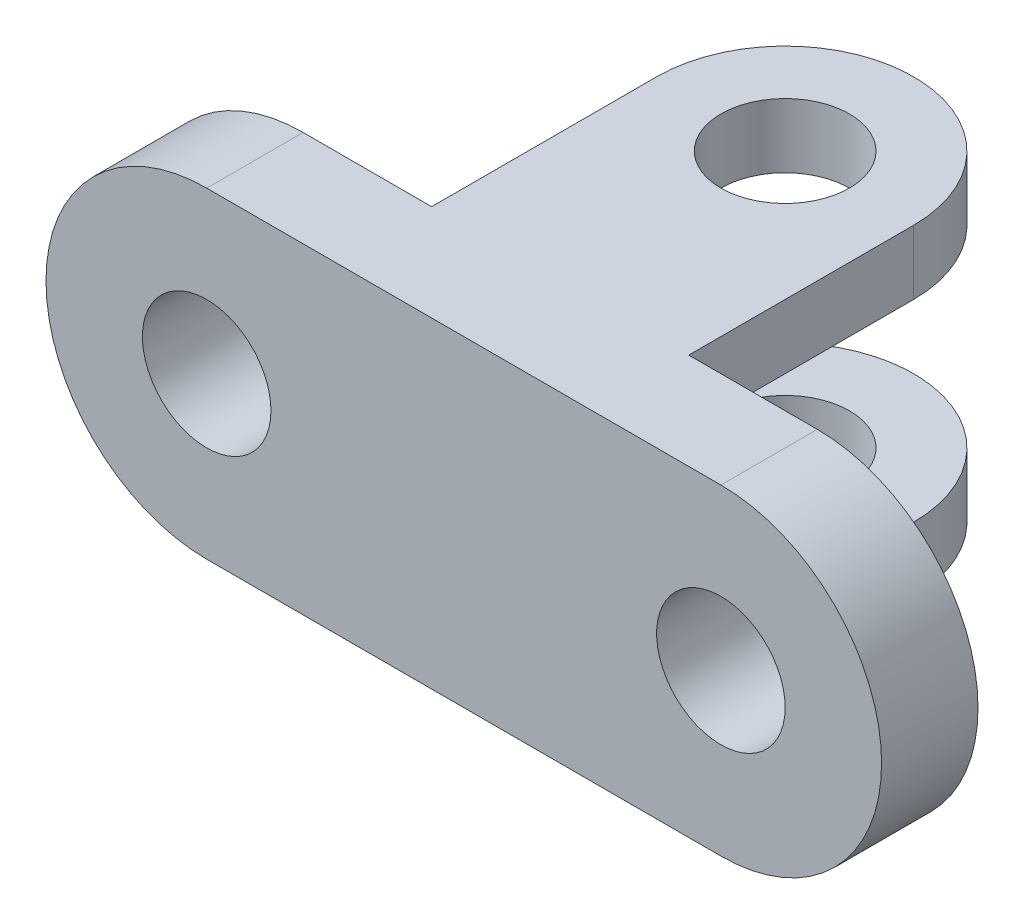
ISO-10303-21;
HEADER;
FILE_DESCRIPTION(('STEP AP214'),'2;1');
FILE_NAME('part.step','',(''),(''),'','','');
FILE_SCHEMA(('AUTOMOTIVE_DESIGN { 1 0 10303 214 1 1 1 1 }'));
ENDSEC;
DATA;
#1=APPLICATION_CONTEXT('core data for automotive mechanical design processes');
#2=APPLICATION_PROTOCOL_DEFINITION('international standard','automotive_design',2000,#1);
#3=PRODUCT_CONTEXT('',#1,'mechanical');
#4=PRODUCT('Part','Part','',(#3));
#5=PRODUCT_RELATED_PRODUCT_CATEGORY('part','',(#4));
#6=PRODUCT_DEFINITION_FORMATION('','',#4);
#7=PRODUCT_DEFINITION_CONTEXT('part definition',#1,'design');
#8=PRODUCT_DEFINITION('design','',#6,#7);
#9=PRODUCT_DEFINITION_SHAPE('','',#8);
#10=(LENGTH_UNIT() NAMED_UNIT(*) SI_UNIT(.MILLI.,.METRE.));
#11=(NAMED_UNIT(*) PLANE_ANGLE_UNIT() SI_UNIT($,.RADIAN.));
#12=(NAMED_UNIT(*) SI_UNIT($,.STERADIAN.) SOLID_ANGLE_UNIT());
#13=UNCERTAINTY_MEASURE_WITH_UNIT(LENGTH_MEASURE(1.E-05),#10,'distance_accuracy_value','');
#14=(GEOMETRIC_REPRESENTATION_CONTEXT(3) GLOBAL_UNCERTAINTY_ASSIGNED_CONTEXT((#13)) GLOBAL_UNIT_ASSIGNED_CONTEXT((#10,
#11,#12)) REPRESENTATION_CONTEXT('',''));
#15=CARTESIAN_POINT('',(0.,0.,0.));
#16=DIRECTION('',(0.,0.,1.));
#17=DIRECTION('',(1.,0.,0.));
#18=AXIS2_PLACEMENT_3D('',#15,#16,#17);
#19=CARTESIAN_POINT('',(20.,25.,-15.));
#20=DIRECTION('',(-1.,0.,0.));
#21=DIRECTION('',(0.,0.,1.));
#22=AXIS2_PLACEMENT_3D('',#19,#20,#21);
#23=PLANE('',#22);
#24=DIRECTION('',(0.,0.,-1.));
#25=VECTOR('',#24,1.);
#26=CARTESIAN_POINT('',(20.,-15.,-15.));
#27=LINE('',#26,#25);
#28=CARTESIAN_POINT('',(20.,-15.,-15.));
#29=VERTEX_POINT('',#28);
#30=CARTESIAN_POINT('',(20.,-15.,-50.));
#31=VERTEX_POINT('',#30);
#32=EDGE_CURVE('E139',#29,#31,#27,.T.);
#33=ORIENTED_EDGE('',*,*,#32,.F.);
#34=DIRECTION('',(0.,-1.,0.));
#35=VECTOR('',#34,1.);
#36=CARTESIAN_POINT('',(20.,25.,-15.));
#37=LINE('',#36,#35);
#38=CARTESIAN_POINT('',(20.,-25.,-15.));
#39=VERTEX_POINT('',#38);
#40=EDGE_CURVE('E147',#29,#39,#37,.T.);
#41=ORIENTED_EDGE('',*,*,#40,.T.);
#42=DIRECTION('',(0.,0.,-1.));
#43=VECTOR('',#42,1.);
#44=CARTESIAN_POINT('',(20.,-25.,-15.));
#45=LINE('',#44,#43);
#46=CARTESIAN_POINT('',(20.,-25.,-50.));
#47=VERTEX_POINT('',#46);
#48=EDGE_CURVE('E252',#39,#47,#45,.T.);
#49=ORIENTED_EDGE('',*,*,#48,.T.);
#50=DIRECTION('',(0.,-1.,0.));
#51=VECTOR('',#50,1.);
#52=CARTESIAN_POINT('',(20.,25.,-50.));
#53=LINE('',#52,#51);
#54=EDGE_CURVE('E149',#31,#47,#53,.T.);
#55=ORIENTED_EDGE('',*,*,#54,.F.);
#56=EDGE_LOOP('',(#33,#41,#49,#55));
#57=FACE_BOUND('',#56,.T.);
#58=ADVANCED_FACE('F45',(#57),#23,.F.);
#59=CARTESIAN_POINT('',(0.,25.,-50.));
#60=DIRECTION('',(0.,-1.,0.));
#61=DIRECTION('',(0.,0.,-1.));
#62=AXIS2_PLACEMENT_3D('',#59,#60,#61);
#63=CYLINDRICAL_SURFACE('',#62,20.);
#64=CARTESIAN_POINT('',(0.,-15.,-50.));
#65=DIRECTION('',(0.,1.,0.));
#66=DIRECTION('',(0.,0.,1.));
#67=AXIS2_PLACEMENT_3D('',#64,#65,#66);
#68=CIRCLE('',#67,20.);
#69=CARTESIAN_POINT('',(-20.,-15.,-50.));
#70=VERTEX_POINT('',#69);
#71=EDGE_CURVE('E63',#31,#70,#68,.T.);
#72=ORIENTED_EDGE('',*,*,#71,.F.);
#73=ORIENTED_EDGE('',*,*,#54,.T.);
#74=CARTESIAN_POINT('',(0.,-25.,-50.));
#75=DIRECTION('',(0.,1.,0.));
#76=DIRECTION('',(0.,0.,1.));
#77=AXIS2_PLACEMENT_3D('',#74,#75,#76);
#78=CIRCLE('',#77,20.);
#79=CARTESIAN_POINT('',(-20.,-25.,-50.));
#80=VERTEX_POINT('',#79);
#81=EDGE_CURVE('E255',#47,#80,#78,.T.);
#82=ORIENTED_EDGE('',*,*,#81,.T.);
#83=DIRECTION('',(0.,-1.,0.));
#84=VECTOR('',#83,1.);
#85=CARTESIAN_POINT('',(-20.,25.,-50.));
#86=LINE('',#85,#84);
#87=EDGE_CURVE('E275',#70,#80,#86,.T.);
#88=ORIENTED_EDGE('',*,*,#87,.F.);
#89=EDGE_LOOP('',(#72,#73,#82,#88));
#90=FACE_BOUND('',#89,.T.);
#91=ADVANCED_FACE('F290',(#90),#63,.T.);
#92=CARTESIAN_POINT('',(-20.,25.,-15.));
#93=DIRECTION('',(-1.,0.,0.));
#94=DIRECTION('',(0.,0.,1.));
#95=AXIS2_PLACEMENT_3D('',#92,#93,#94);
#96=PLANE('',#95);
#97=DIRECTION('',(0.,-1.,0.));
#98=VECTOR('',#97,1.);
#99=CARTESIAN_POINT('',(-20.,25.,-15.));
#100=LINE('',#99,#98);
#101=CARTESIAN_POINT('',(-20.,-15.,-15.));
#102=VERTEX_POINT('',#101);
#103=CARTESIAN_POINT('',(-20.,-25.,-15.));
#104=VERTEX_POINT('',#103);
#105=EDGE_CURVE('E71',#102,#104,#100,.T.);
#106=ORIENTED_EDGE('',*,*,#105,.F.);
#107=DIRECTION('',(0.,0.,1.));
#108=VECTOR('',#107,1.);
#109=CARTESIAN_POINT('',(-20.,-15.,-15.));
#110=LINE('',#109,#108);
#111=EDGE_CURVE('E140',#70,#102,#110,.T.);
#112=ORIENTED_EDGE('',*,*,#111,.F.);
#113=ORIENTED_EDGE('',*,*,#87,.T.);
#114=DIRECTION('',(0.,0.,-1.));
#115=VECTOR('',#114,1.);
#116=CARTESIAN_POINT('',(-20.,-25.,-15.));
#117=LINE('',#116,#115);
#118=EDGE_CURVE('E259',#104,#80,#117,.T.);
#119=ORIENTED_EDGE('',*,*,#118,.F.);
#120=EDGE_LOOP('',(#106,#112,#113,#119));
#121=FACE_BOUND('',#120,.T.);
#122=ADVANCED_FACE('F284',(#121),#96,.T.);
#123=CARTESIAN_POINT('',(0.,-25.,-50.));
#124=DIRECTION('',(0.,-1.,0.));
#125=DIRECTION('',(0.,0.,-1.));
#126=AXIS2_PLACEMENT_3D('',#123,#124,#125);
#127=CYLINDRICAL_SURFACE('',#126,9.99999999999998);
#128=CARTESIAN_POINT('',(0.,-25.,-50.));
#129=DIRECTION('',(0.,-1.,0.));
#130=DIRECTION('',(0.,0.,-1.));
#131=AXIS2_PLACEMENT_3D('',#128,#129,#130);
#132=CIRCLE('',#131,9.99999999999999);
#133=CARTESIAN_POINT('',(0.,-25.,-60.));
#134=VERTEX_POINT('',#133);
#135=EDGE_CURVE('E231',#134,#134,#132,.T.);
#136=ORIENTED_EDGE('',*,*,#135,.T.);
#137=EDGE_LOOP('',(#136));
#138=FACE_BOUND('',#137,.T.);
#139=CARTESIAN_POINT('',(0.,-15.,-50.));
#140=DIRECTION('',(0.,1.,0.));
#141=DIRECTION('',(0.,0.,1.));
#142=AXIS2_PLACEMENT_3D('',#139,#140,#141);
#143=CIRCLE('',#142,9.99999999999998);
#144=CARTESIAN_POINT('',(0.,-15.,-40.));
#145=VERTEX_POINT('',#144);
#146=EDGE_CURVE('E223',#145,#145,#143,.F.);
#147=ORIENTED_EDGE('',*,*,#146,.F.);
#148=EDGE_LOOP('',(#147));
#149=FACE_BOUND('',#148,.T.);
#150=ADVANCED_FACE('F325',(#138,#149),#127,.F.);
#151=CARTESIAN_POINT('',(-40.,0.,-15.));
#152=DIRECTION('',(0.,0.,1.));
#153=DIRECTION('',(1.,0.,0.));
#154=AXIS2_PLACEMENT_3D('',#151,#152,#153);
#155=CYLINDRICAL_SURFACE('',#154,25.);
#156=CARTESIAN_POINT('',(-40.,0.,0.));
#157=DIRECTION('',(0.,0.,1.));
#158=DIRECTION('',(1.,0.,0.));
#159=AXIS2_PLACEMENT_3D('',#156,#157,#158);
#160=CIRCLE('',#159,25.);
#161=CARTESIAN_POINT('',(-40.,25.,0.));
#162=VERTEX_POINT('',#161);
#163=CARTESIAN_POINT('',(-40.,-25.,0.));
#164=VERTEX_POINT('',#163);
#165=EDGE_CURVE('E181',#162,#164,#160,.T.);
#166=ORIENTED_EDGE('',*,*,#165,.F.);
#167=DIRECTION('',(0.,0.,1.));
#168=VECTOR('',#167,1.);
#169=CARTESIAN_POINT('',(-40.,25.,-15.));
#170=LINE('',#169,#168);
#171=CARTESIAN_POINT('',(-40.,25.,-15.));
#172=VERTEX_POINT('',#171);
#173=EDGE_CURVE('E11',#172,#162,#170,.T.);
#174=ORIENTED_EDGE('',*,*,#173,.F.);
#175=CARTESIAN_POINT('',(-40.,0.,-15.));
#176=DIRECTION('',(0.,0.,1.));
#177=DIRECTION('',(1.,0.,0.));
#178=AXIS2_PLACEMENT_3D('',#175,#176,#177);
#179=CIRCLE('',#178,25.);
#180=CARTESIAN_POINT('',(-40.,-25.,-15.));
#181=VERTEX_POINT('',#180);
#182=EDGE_CURVE('E185',#172,#181,#179,.T.);
#183=ORIENTED_EDGE('',*,*,#182,.T.);
#184=DIRECTION('',(0.,0.,1.));
#185=VECTOR('',#184,1.);
#186=CARTESIAN_POINT('',(-40.,-25.,-15.));
#187=LINE('',#186,#185);
#188=EDGE_CURVE('E202',#181,#164,#187,.T.);
#189=ORIENTED_EDGE('',*,*,#188,.T.);
#190=EDGE_LOOP('',(#166,#174,#183,#189));
#191=FACE_BOUND('',#190,.T.);
#192=ADVANCED_FACE('F47',(#191),#155,.T.);
#193=CARTESIAN_POINT('',(-40.,25.,-15.));
#194=DIRECTION('',(0.,1.,0.));
#195=DIRECTION('',(0.,0.,1.));
#196=AXIS2_PLACEMENT_3D('',#193,#194,#195);
#197=PLANE('',#196);
#198=CARTESIAN_POINT('',(0.,25.,-50.));
#199=DIRECTION('',(0.,1.,0.));
#200=DIRECTION('',(0.,0.,1.));
#201=AXIS2_PLACEMENT_3D('',#198,#199,#200);
#202=CIRCLE('',#201,9.99999999999998);
#203=CARTESIAN_POINT('',(0.,25.,-40.));
#204=VERTEX_POINT('',#203);
#205=EDGE_CURVE('E248',#204,#204,#202,.T.);
#206=ORIENTED_EDGE('',*,*,#205,.F.);
#207=EDGE_LOOP('',(#206));
#208=FACE_BOUND('',#207,.T.);
#209=DIRECTION('',(-1.,0.,0.));
#210=VECTOR('',#209,1.);
#211=CARTESIAN_POINT('',(-40.,25.,0.));
#212=LINE('',#211,#210);
#213=CARTESIAN_POINT('',(40.,25.,0.));
#214=VERTEX_POINT('',#213);
#215=EDGE_CURVE('E189',#214,#162,#212,.T.);
#216=ORIENTED_EDGE('',*,*,#215,.F.);
#217=DIRECTION('',(0.,0.,1.));
#218=VECTOR('',#217,1.);
#219=CARTESIAN_POINT('',(40.,25.,-15.));
#220=LINE('',#219,#218);
#221=CARTESIAN_POINT('',(40.,25.,-15.));
#222=VERTEX_POINT('',#221);
#223=EDGE_CURVE('E55',#222,#214,#220,.T.);
#224=ORIENTED_EDGE('',*,*,#223,.F.);
#225=DIRECTION('',(-1.,0.,0.));
#226=VECTOR('',#225,1.);
#227=CARTESIAN_POINT('',(-40.,25.,-15.));
#228=LINE('',#227,#226);
#229=CARTESIAN_POINT('',(20.,25.,-15.));
#230=VERTEX_POINT('',#229);
#231=EDGE_CURVE('E198',#222,#230,#228,.T.);
#232=ORIENTED_EDGE('',*,*,#231,.T.);
#233=DIRECTION('',(0.,0.,-1.));
#234=VECTOR('',#233,1.);
#235=CARTESIAN_POINT('',(20.,25.,-15.));
#236=LINE('',#235,#234);
#237=CARTESIAN_POINT('',(20.,25.,-50.));
#238=VERTEX_POINT('',#237);
#239=EDGE_CURVE('E263',#230,#238,#236,.T.);
#240=ORIENTED_EDGE('',*,*,#239,.T.);
#241=CARTESIAN_POINT('',(0.,25.,-50.));
#242=DIRECTION('',(0.,1.,0.));
#243=DIRECTION('',(0.,0.,1.));
#244=AXIS2_PLACEMENT_3D('',#241,#242,#243);
#245=CIRCLE('',#244,20.);
#246=CARTESIAN_POINT('',(-20.,25.,-50.));
#247=VERTEX_POINT('',#246);
#248=EDGE_CURVE('E266',#238,#247,#245,.T.);
#249=ORIENTED_EDGE('',*,*,#248,.T.);
#250=DIRECTION('',(0.,0.,-1.));
#251=VECTOR('',#250,1.);
#252=CARTESIAN_POINT('',(-20.,25.,-15.));
#253=LINE('',#252,#251);
#254=CARTESIAN_POINT('',(-20.,25.,-15.));
#255=VERTEX_POINT('',#254);
#256=EDGE_CURVE('E269',#255,#247,#253,.T.);
#257=ORIENTED_EDGE('',*,*,#256,.F.);
#258=EDGE_CURVE('E197',#255,#172,#228,.T.);
#259=ORIENTED_EDGE('',*,*,#258,.T.);
#260=ORIENTED_EDGE('',*,*,#173,.T.);
#261=EDGE_LOOP('',(#216,#224,#232,#240,#249,#257,#259,#260));
#262=FACE_BOUND('',#261,.T.);
#263=ADVANCED_FACE('F312',(#208,#262),#197,.T.);
#264=CARTESIAN_POINT('',(40.,0.,-15.));
#265=DIRECTION('',(0.,0.,1.));
#266=DIRECTION('',(1.,0.,0.));
#267=AXIS2_PLACEMENT_3D('',#264,#265,#266);
#268=CYLINDRICAL_SURFACE('',#267,25.);
#269=CARTESIAN_POINT('',(40.,0.,0.));
#270=DIRECTION('',(0.,0.,1.));
#271=DIRECTION('',(1.,0.,0.));
#272=AXIS2_PLACEMENT_3D('',#269,#270,#271);
#273=CIRCLE('',#272,25.);
#274=CARTESIAN_POINT('',(40.,-25.,0.));
#275=VERTEX_POINT('',#274);
#276=EDGE_CURVE('E210',#275,#214,#273,.T.);
#277=ORIENTED_EDGE('',*,*,#276,.F.);
#278=DIRECTION('',(0.,0.,1.));
#279=VECTOR('',#278,1.);
#280=CARTESIAN_POINT('',(40.,-25.,-15.));
#281=LINE('',#280,#279);
#282=CARTESIAN_POINT('',(40.,-25.,-15.));
#283=VERTEX_POINT('',#282);
#284=EDGE_CURVE('E219',#283,#275,#281,.T.);
#285=ORIENTED_EDGE('',*,*,#284,.F.);
#286=CARTESIAN_POINT('',(40.,0.,-15.));
#287=DIRECTION('',(0.,0.,1.));
#288=DIRECTION('',(1.,0.,0.));
#289=AXIS2_PLACEMENT_3D('',#286,#287,#288);
#290=CIRCLE('',#289,25.);
#291=EDGE_CURVE('E193',#283,#222,#290,.T.);
#292=ORIENTED_EDGE('',*,*,#291,.T.);
#293=ORIENTED_EDGE('',*,*,#223,.T.);
#294=EDGE_LOOP('',(#277,#285,#292,#293));
#295=FACE_BOUND('',#294,.T.);
#296=ADVANCED_FACE('F329',(#295),#268,.T.);
#297=CARTESIAN_POINT('',(-40.,-25.,-15.));
#298=DIRECTION('',(0.,-1.,0.));
#299=DIRECTION('',(1.,0.,0.));
#300=AXIS2_PLACEMENT_3D('',#297,#298,#299);
#301=PLANE('',#300);
#302=ORIENTED_EDGE('',*,*,#135,.F.);
#303=EDGE_LOOP('',(#302));
#304=FACE_BOUND('',#303,.T.);
#305=DIRECTION('',(1.,0.,0.));
#306=VECTOR('',#305,1.);
#307=CARTESIAN_POINT('',(-40.,-25.,0.));
#308=LINE('',#307,#306);
#309=EDGE_CURVE('E206',#164,#275,#308,.T.);
#310=ORIENTED_EDGE('',*,*,#309,.F.);
#311=ORIENTED_EDGE('',*,*,#188,.F.);
#312=DIRECTION('',(1.,0.,0.));
#313=VECTOR('',#312,1.);
#314=CARTESIAN_POINT('',(-40.,-25.,-15.));
#315=LINE('',#314,#313);
#316=EDGE_CURVE('E190',#181,#104,#315,.T.);
#317=ORIENTED_EDGE('',*,*,#316,.T.);
#318=ORIENTED_EDGE('',*,*,#118,.T.);
#319=ORIENTED_EDGE('',*,*,#81,.F.);
#320=ORIENTED_EDGE('',*,*,#48,.F.);
#321=EDGE_CURVE('E155',#39,#283,#315,.T.);
#322=ORIENTED_EDGE('',*,*,#321,.T.);
#323=ORIENTED_EDGE('',*,*,#284,.T.);
#324=EDGE_LOOP('',(#310,#311,#317,#318,#319,#320,#322,#323));
#325=FACE_BOUND('',#324,.T.);
#326=ADVANCED_FACE('F289',(#304,#325),#301,.T.);
#327=CARTESIAN_POINT('',(-40.,0.,-15.));
#328=DIRECTION('',(0.,0.,1.));
#329=DIRECTION('',(1.,0.,0.));
#330=AXIS2_PLACEMENT_3D('',#327,#328,#329);
#331=PLANE('',#330);
#332=CARTESIAN_POINT('',(-40.,0.,-15.));
#333=DIRECTION('',(0.,0.,1.));
#334=DIRECTION('',(1.,0.,0.));
#335=AXIS2_PLACEMENT_3D('',#332,#333,#334);
#336=CIRCLE('',#335,10.);
#337=CARTESIAN_POINT('',(-30.,0.,-15.));
#338=VERTEX_POINT('',#337);
#339=EDGE_CURVE('E177',#338,#338,#336,.T.);
#340=ORIENTED_EDGE('',*,*,#339,.T.);
#341=EDGE_LOOP('',(#340));
#342=FACE_BOUND('',#341,.T.);
#343=ORIENTED_EDGE('',*,*,#258,.F.);
#344=CARTESIAN_POINT('',(-20.,15.,-15.));
#345=VERTEX_POINT('',#344);
#346=EDGE_CURVE('E273',#255,#345,#100,.T.);
#347=ORIENTED_EDGE('',*,*,#346,.T.);
#348=DIRECTION('',(1.,0.,0.));
#349=VECTOR('',#348,1.);
#350=CARTESIAN_POINT('',(-20.,15.,-15.));
#351=LINE('',#350,#349);
#352=CARTESIAN_POINT('',(20.,15.,-15.));
#353=VERTEX_POINT('',#352);
#354=EDGE_CURVE('E294',#345,#353,#351,.T.);
#355=ORIENTED_EDGE('',*,*,#354,.T.);
#356=EDGE_CURVE('E158',#230,#353,#37,.T.);
#357=ORIENTED_EDGE('',*,*,#356,.F.);
#358=ORIENTED_EDGE('',*,*,#231,.F.);
#359=ORIENTED_EDGE('',*,*,#291,.F.);
#360=ORIENTED_EDGE('',*,*,#321,.F.);
#361=ORIENTED_EDGE('',*,*,#40,.F.);
#362=DIRECTION('',(1.,0.,0.));
#363=VECTOR('',#362,1.);
#364=CARTESIAN_POINT('',(-20.,-15.,-15.));
#365=LINE('',#364,#363);
#366=EDGE_CURVE('E135',#102,#29,#365,.T.);
#367=ORIENTED_EDGE('',*,*,#366,.F.);
#368=ORIENTED_EDGE('',*,*,#105,.T.);
#369=ORIENTED_EDGE('',*,*,#316,.F.);
#370=ORIENTED_EDGE('',*,*,#182,.F.);
#371=EDGE_LOOP('',(#343,#347,#355,#357,#358,#359,#360,#361,#367,#368,#369,#370));
#372=FACE_BOUND('',#371,.T.);
#373=CARTESIAN_POINT('',(40.,0.,-15.));
#374=DIRECTION('',(0.,0.,1.));
#375=DIRECTION('',(1.,0.,0.));
#376=AXIS2_PLACEMENT_3D('',#373,#374,#375);
#377=CIRCLE('',#376,10.);
#378=CARTESIAN_POINT('',(50.,0.,-15.));
#379=VERTEX_POINT('',#378);
#380=EDGE_CURVE('E169',#379,#379,#377,.T.);
#381=ORIENTED_EDGE('',*,*,#380,.T.);
#382=EDGE_LOOP('',(#381));
#383=FACE_BOUND('',#382,.T.);
#384=ADVANCED_FACE('F152',(#342,#372,#383),#331,.F.);
#385=CARTESIAN_POINT('',(-40.,0.,0.));
#386=DIRECTION('',(0.,0.,1.));
#387=DIRECTION('',(1.,0.,0.));
#388=AXIS2_PLACEMENT_3D('',#385,#386,#387);
#389=PLANE('',#388);
#390=CARTESIAN_POINT('',(40.,0.,0.));
#391=DIRECTION('',(0.,0.,1.));
#392=DIRECTION('',(1.,0.,0.));
#393=AXIS2_PLACEMENT_3D('',#390,#391,#392);
#394=CIRCLE('',#393,10.);
#395=CARTESIAN_POINT('',(50.,0.,0.));
#396=VERTEX_POINT('',#395);
#397=EDGE_CURVE('E164',#396,#396,#394,.T.);
#398=ORIENTED_EDGE('',*,*,#397,.F.);
#399=EDGE_LOOP('',(#398));
#400=FACE_BOUND('',#399,.T.);
#401=CARTESIAN_POINT('',(-40.,0.,0.));
#402=DIRECTION('',(0.,0.,1.));
#403=DIRECTION('',(1.,0.,0.));
#404=AXIS2_PLACEMENT_3D('',#401,#402,#403);
#405=CIRCLE('',#404,10.);
#406=CARTESIAN_POINT('',(-30.,0.,0.));
#407=VERTEX_POINT('',#406);
#408=EDGE_CURVE('E173',#407,#407,#405,.T.);
#409=ORIENTED_EDGE('',*,*,#408,.F.);
#410=EDGE_LOOP('',(#409));
#411=FACE_BOUND('',#410,.T.);
#412=ORIENTED_EDGE('',*,*,#165,.T.);
#413=ORIENTED_EDGE('',*,*,#309,.T.);
#414=ORIENTED_EDGE('',*,*,#276,.T.);
#415=ORIENTED_EDGE('',*,*,#215,.T.);
#416=EDGE_LOOP('',(#412,#413,#414,#415));
#417=FACE_BOUND('',#416,.T.);
#418=ADVANCED_FACE('F359',(#400,#411,#417),#389,.T.);
#419=CARTESIAN_POINT('',(-40.,0.,-15.));
#420=DIRECTION('',(0.,0.,1.));
#421=DIRECTION('',(1.,0.,0.));
#422=AXIS2_PLACEMENT_3D('',#419,#420,#421);
#423=CYLINDRICAL_SURFACE('',#422,10.);
#424=ORIENTED_EDGE('',*,*,#339,.F.);
#425=EDGE_LOOP('',(#424));
#426=FACE_BOUND('',#425,.T.);
#427=ORIENTED_EDGE('',*,*,#408,.T.);
#428=EDGE_LOOP('',(#427));
#429=FACE_BOUND('',#428,.T.);
#430=ADVANCED_FACE('F354',(#426,#429),#423,.F.);
#431=CARTESIAN_POINT('',(40.,0.,-15.));
#432=DIRECTION('',(0.,0.,1.));
#433=DIRECTION('',(1.,0.,0.));
#434=AXIS2_PLACEMENT_3D('',#431,#432,#433);
#435=CYLINDRICAL_SURFACE('',#434,10.);
#436=ORIENTED_EDGE('',*,*,#380,.F.);
#437=EDGE_LOOP('',(#436));
#438=FACE_BOUND('',#437,.T.);
#439=ORIENTED_EDGE('',*,*,#397,.T.);
#440=EDGE_LOOP('',(#439));
#441=FACE_BOUND('',#440,.T.);
#442=ADVANCED_FACE('F349',(#438,#441),#435,.F.);
#443=ORIENTED_EDGE('',*,*,#356,.T.);
#444=DIRECTION('',(0.,0.,-1.));
#445=VECTOR('',#444,1.);
#446=CARTESIAN_POINT('',(20.,15.,-15.));
#447=LINE('',#446,#445);
#448=CARTESIAN_POINT('',(20.,15.,-50.));
#449=VERTEX_POINT('',#448);
#450=EDGE_CURVE('E241',#353,#449,#447,.T.);
#451=ORIENTED_EDGE('',*,*,#450,.T.);
#452=EDGE_CURVE('E159',#238,#449,#53,.T.);
#453=ORIENTED_EDGE('',*,*,#452,.F.);
#454=ORIENTED_EDGE('',*,*,#239,.F.);
#455=EDGE_LOOP('',(#443,#451,#453,#454));
#456=FACE_BOUND('',#455,.T.);
#457=ADVANCED_FACE('F303',(#456),#23,.F.);
#458=ORIENTED_EDGE('',*,*,#452,.T.);
#459=CARTESIAN_POINT('',(0.,15.,-50.));
#460=DIRECTION('',(0.,1.,0.));
#461=DIRECTION('',(0.,0.,1.));
#462=AXIS2_PLACEMENT_3D('',#459,#460,#461);
#463=CIRCLE('',#462,20.);
#464=CARTESIAN_POINT('',(-20.,15.,-50.));
#465=VERTEX_POINT('',#464);
#466=EDGE_CURVE('E233',#449,#465,#463,.T.);
#467=ORIENTED_EDGE('',*,*,#466,.T.);
#468=EDGE_CURVE('E276',#247,#465,#86,.T.);
#469=ORIENTED_EDGE('',*,*,#468,.F.);
#470=ORIENTED_EDGE('',*,*,#248,.F.);
#471=EDGE_LOOP('',(#458,#467,#469,#470));
#472=FACE_BOUND('',#471,.T.);
#473=ADVANCED_FACE('F308',(#472),#63,.T.);
#474=DIRECTION('',(0.,0.,1.));
#475=VECTOR('',#474,1.);
#476=CARTESIAN_POINT('',(-20.,15.,-15.));
#477=LINE('',#476,#475);
#478=EDGE_CURVE('E226',#465,#345,#477,.T.);
#479=ORIENTED_EDGE('',*,*,#478,.T.);
#480=ORIENTED_EDGE('',*,*,#346,.F.);
#481=ORIENTED_EDGE('',*,*,#256,.T.);
#482=ORIENTED_EDGE('',*,*,#468,.T.);
#483=EDGE_LOOP('',(#479,#480,#481,#482));
#484=FACE_BOUND('',#483,.T.);
#485=ADVANCED_FACE('F323',(#484),#96,.T.);
#486=CARTESIAN_POINT('',(0.,15.,-50.));
#487=DIRECTION('',(0.,1.,0.));
#488=DIRECTION('',(0.,0.,1.));
#489=AXIS2_PLACEMENT_3D('',#486,#487,#488);
#490=CIRCLE('',#489,9.99999999999998);
#491=CARTESIAN_POINT('',(0.,15.,-40.));
#492=VERTEX_POINT('',#491);
#493=EDGE_CURVE('E49',#492,#492,#490,.F.);
#494=ORIENTED_EDGE('',*,*,#493,.T.);
#495=EDGE_LOOP('',(#494));
#496=FACE_BOUND('',#495,.T.);
#497=ORIENTED_EDGE('',*,*,#205,.T.);
#498=EDGE_LOOP('',(#497));
#499=FACE_BOUND('',#498,.T.);
#500=ADVANCED_FACE('F317',(#496,#499),#127,.F.);
#501=CARTESIAN_POINT('',(0.,15.,-50.));
#502=DIRECTION('',(0.,1.,0.));
#503=DIRECTION('',(0.,0.,1.));
#504=AXIS2_PLACEMENT_3D('',#501,#502,#503);
#505=PLANE('',#504);
#506=ORIENTED_EDGE('',*,*,#354,.F.);
#507=ORIENTED_EDGE('',*,*,#478,.F.);
#508=ORIENTED_EDGE('',*,*,#466,.F.);
#509=ORIENTED_EDGE('',*,*,#450,.F.);
#510=EDGE_LOOP('',(#506,#507,#508,#509));
#511=FACE_BOUND('',#510,.T.);
#512=ORIENTED_EDGE('',*,*,#493,.F.);
#513=EDGE_LOOP('',(#512));
#514=FACE_BOUND('',#513,.T.);
#515=ADVANCED_FACE('F314',(#511,#514),#505,.F.);
#516=CARTESIAN_POINT('',(0.,-15.,-50.));
#517=DIRECTION('',(0.,1.,0.));
#518=DIRECTION('',(0.,0.,1.));
#519=AXIS2_PLACEMENT_3D('',#516,#517,#518);
#520=PLANE('',#519);
#521=ORIENTED_EDGE('',*,*,#366,.T.);
#522=ORIENTED_EDGE('',*,*,#32,.T.);
#523=ORIENTED_EDGE('',*,*,#71,.T.);
#524=ORIENTED_EDGE('',*,*,#111,.T.);
#525=EDGE_LOOP('',(#521,#522,#523,#524));
#526=FACE_BOUND('',#525,.T.);
#527=ORIENTED_EDGE('',*,*,#146,.T.);
#528=EDGE_LOOP('',(#527));
#529=FACE_BOUND('',#528,.T.);
#530=ADVANCED_FACE('F137',(#526,#529),#520,.T.);
#531=CLOSED_SHELL('',(#58,#91,#122,#150,#192,#263,#296,#326,#384,#418,#430,#442,#457,#473,#485,
#500,#515,#530));
#532=MANIFOLD_SOLID_BREP('B2',#531);
#533=ADVANCED_BREP_SHAPE_REPRESENTATION('',(#18,#532),#14);
#534=SHAPE_DEFINITION_REPRESENTATION(#9,#533);
ENDSEC;
END-ISO-10303-21;
